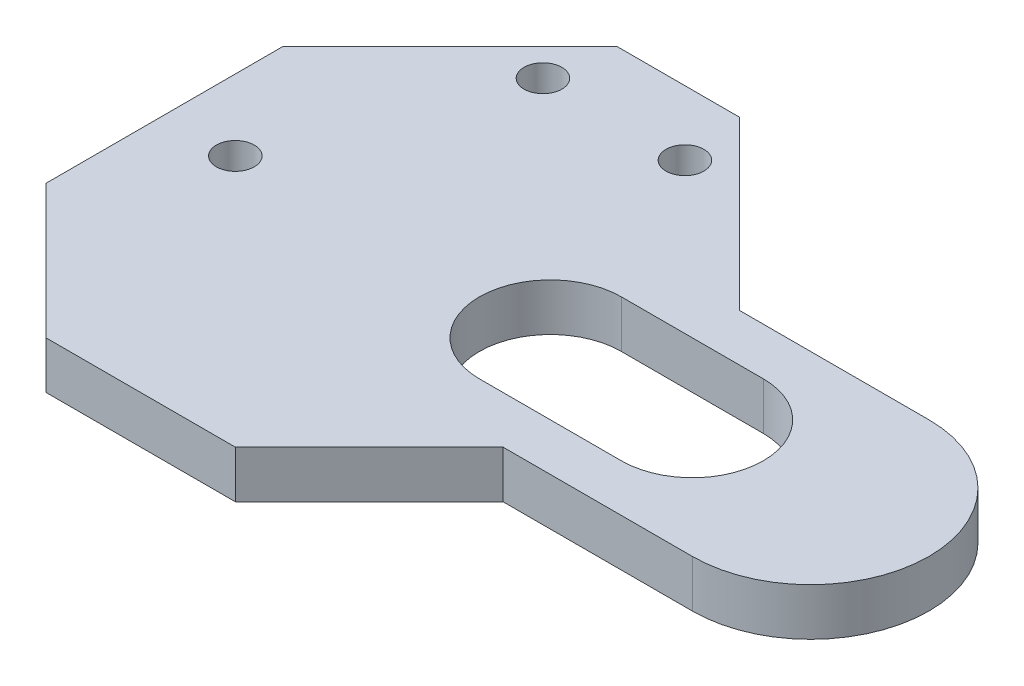
ISO-10303-21;
HEADER;
FILE_DESCRIPTION(('STEP AP214'),'2;1');
FILE_NAME('part.step','',(''),(''),'','','');
FILE_SCHEMA(('AUTOMOTIVE_DESIGN { 1 0 10303 214 1 1 1 1 }'));
ENDSEC;
DATA;
#1=APPLICATION_CONTEXT('core data for automotive mechanical design processes');
#2=APPLICATION_PROTOCOL_DEFINITION('international standard','automotive_design',2000,#1);
#3=PRODUCT_CONTEXT('',#1,'mechanical');
#4=PRODUCT('Part','Part','',(#3));
#5=PRODUCT_RELATED_PRODUCT_CATEGORY('part','',(#4));
#6=PRODUCT_DEFINITION_FORMATION('','',#4);
#7=PRODUCT_DEFINITION_CONTEXT('part definition',#1,'design');
#8=PRODUCT_DEFINITION('design','',#6,#7);
#9=PRODUCT_DEFINITION_SHAPE('','',#8);
#10=(LENGTH_UNIT() NAMED_UNIT(*) SI_UNIT(.MILLI.,.METRE.));
#11=(NAMED_UNIT(*) PLANE_ANGLE_UNIT() SI_UNIT($,.RADIAN.));
#12=(NAMED_UNIT(*) SI_UNIT($,.STERADIAN.) SOLID_ANGLE_UNIT());
#13=UNCERTAINTY_MEASURE_WITH_UNIT(LENGTH_MEASURE(1.E-05),#10,'distance_accuracy_value','');
#14=(GEOMETRIC_REPRESENTATION_CONTEXT(3) GLOBAL_UNCERTAINTY_ASSIGNED_CONTEXT((#13)) GLOBAL_UNIT_ASSIGNED_CONTEXT((#10,
#11,#12)) REPRESENTATION_CONTEXT('',''));
#15=CARTESIAN_POINT('',(0.,0.,0.));
#16=DIRECTION('',(0.,0.,1.));
#17=DIRECTION('',(1.,0.,0.));
#18=AXIS2_PLACEMENT_3D('',#15,#16,#17);
#19=CARTESIAN_POINT('',(108.284271247462,10.,-53.2842712474617));
#20=DIRECTION('',(0.,-1.,0.));
#21=DIRECTION('',(0.,0.,-1.));
#22=AXIS2_PLACEMENT_3D('',#19,#20,#21);
#23=PLANE('',#22);
#24=CARTESIAN_POINT('',(-13.2842712474621,10.,-53.2842712474617));
#25=DIRECTION('',(0.,1.,0.));
#26=DIRECTION('',(0.,0.,1.));
#27=AXIS2_PLACEMENT_3D('',#24,#25,#26);
#28=CIRCLE('',#27,4.);
#29=CARTESIAN_POINT('',(-13.2842712474621,10.,-49.2842712474617));
#30=VERTEX_POINT('',#29);
#31=EDGE_CURVE('E169',#30,#30,#28,.T.);
#32=ORIENTED_EDGE('',*,*,#31,.F.);
#33=EDGE_LOOP('',(#32));
#34=FACE_BOUND('',#33,.T.);
#35=CARTESIAN_POINT('',(4.99999999999999,10.,-100.));
#36=DIRECTION('',(0.,1.,0.));
#37=DIRECTION('',(0.,0.,1.));
#38=AXIS2_PLACEMENT_3D('',#35,#36,#37);
#39=CIRCLE('',#38,4.);
#40=CARTESIAN_POINT('',(4.99999999999999,10.,-96.));
#41=VERTEX_POINT('',#40);
#42=EDGE_CURVE('E181',#41,#41,#39,.T.);
#43=ORIENTED_EDGE('',*,*,#42,.F.);
#44=EDGE_LOOP('',(#43));
#45=FACE_BOUND('',#44,.T.);
#46=DIRECTION('',(0.707106781186554,0.,0.707106781186541));
#47=VECTOR('',#46,1.);
#48=CARTESIAN_POINT('',(0.,10.,0.));
#49=LINE('',#48,#47);
#50=CARTESIAN_POINT('',(-28.2842712474622,10.,-28.2842712474617));
#51=VERTEX_POINT('',#50);
#52=CARTESIAN_POINT('',(0.,10.,0.));
#53=VERTEX_POINT('',#52);
#54=EDGE_CURVE('E187',#51,#53,#49,.T.);
#55=ORIENTED_EDGE('',*,*,#54,.T.);
#56=DIRECTION('',(1.,0.,0.));
#57=VECTOR('',#56,1.);
#58=CARTESIAN_POINT('',(0.,10.,0.));
#59=LINE('',#58,#57);
#60=CARTESIAN_POINT('',(40.,10.,0.));
#61=VERTEX_POINT('',#60);
#62=EDGE_CURVE('E190',#53,#61,#59,.T.);
#63=ORIENTED_EDGE('',*,*,#62,.T.);
#64=DIRECTION('',(0.707106781186552,0.,-0.707106781186544));
#65=VECTOR('',#64,1.);
#66=CARTESIAN_POINT('',(68.2842712474621,10.,-28.2842712474617));
#67=LINE('',#66,#65);
#68=CARTESIAN_POINT('',(68.2842712474621,10.,-28.2842712474617));
#69=VERTEX_POINT('',#68);
#70=EDGE_CURVE('E193',#61,#69,#67,.T.);
#71=ORIENTED_EDGE('',*,*,#70,.T.);
#72=DIRECTION('',(1.,0.,0.));
#73=VECTOR('',#72,1.);
#74=CARTESIAN_POINT('',(108.284271247462,10.,-28.2842712474617));
#75=LINE('',#74,#73);
#76=CARTESIAN_POINT('',(108.284271247462,10.,-28.2842712474617));
#77=VERTEX_POINT('',#76);
#78=EDGE_CURVE('E195',#69,#77,#75,.T.);
#79=ORIENTED_EDGE('',*,*,#78,.T.);
#80=CARTESIAN_POINT('',(108.284271247462,10.,-53.2842712474617));
#81=DIRECTION('',(0.,1.,0.));
#82=DIRECTION('',(0.,0.,-1.));
#83=AXIS2_PLACEMENT_3D('',#80,#81,#82);
#84=CIRCLE('',#83,25.);
#85=CARTESIAN_POINT('',(108.284271247462,10.,-78.2842712474617));
#86=VERTEX_POINT('',#85);
#87=EDGE_CURVE('E197',#77,#86,#84,.T.);
#88=ORIENTED_EDGE('',*,*,#87,.T.);
#89=DIRECTION('',(-1.,0.,0.));
#90=VECTOR('',#89,1.);
#91=CARTESIAN_POINT('',(68.2842712474621,10.,-78.2842712474617));
#92=LINE('',#91,#90);
#93=CARTESIAN_POINT('',(68.2842712474621,10.,-78.2842712474617));
#94=VERTEX_POINT('',#93);
#95=EDGE_CURVE('E199',#86,#94,#92,.T.);
#96=ORIENTED_EDGE('',*,*,#95,.T.);
#97=DIRECTION('',(-0.707106781186549,0.,-0.707106781186546));
#98=VECTOR('',#97,1.);
#99=CARTESIAN_POINT('',(32.9289321881346,10.,-113.639610306789));
#100=LINE('',#99,#98);
#101=CARTESIAN_POINT('',(32.9289321881346,10.,-113.639610306789));
#102=VERTEX_POINT('',#101);
#103=EDGE_CURVE('E201',#94,#102,#100,.T.);
#104=ORIENTED_EDGE('',*,*,#103,.T.);
#105=DIRECTION('',(-1.,0.,0.));
#106=VECTOR('',#105,1.);
#107=CARTESIAN_POINT('',(7.07106781186537,10.,-113.639610306789));
#108=LINE('',#107,#106);
#109=CARTESIAN_POINT('',(7.07106781186537,10.,-113.639610306789));
#110=VERTEX_POINT('',#109);
#111=EDGE_CURVE('E203',#102,#110,#108,.T.);
#112=ORIENTED_EDGE('',*,*,#111,.T.);
#113=DIRECTION('',(-0.707106781186549,0.,0.707106781186546));
#114=VECTOR('',#113,1.);
#115=CARTESIAN_POINT('',(-28.2842712474621,10.,-78.2842712474617));
#116=LINE('',#115,#114);
#117=CARTESIAN_POINT('',(-28.2842712474621,10.,-78.2842712474617));
#118=VERTEX_POINT('',#117);
#119=EDGE_CURVE('E205',#110,#118,#116,.T.);
#120=ORIENTED_EDGE('',*,*,#119,.T.);
#121=DIRECTION('',(0.,0.,1.));
#122=VECTOR('',#121,1.);
#123=CARTESIAN_POINT('',(-28.2842712474622,10.,-28.2842712474617));
#124=LINE('',#123,#122);
#125=EDGE_CURVE('E207',#118,#51,#124,.T.);
#126=ORIENTED_EDGE('',*,*,#125,.T.);
#127=EDGE_LOOP('',(#55,#63,#71,#79,#88,#96,#104,#112,#120,#126));
#128=FACE_BOUND('',#127,.T.);
#129=CARTESIAN_POINT('',(35.,10.,-100.));
#130=DIRECTION('',(0.,1.,0.));
#131=DIRECTION('',(0.,0.,1.));
#132=AXIS2_PLACEMENT_3D('',#129,#130,#131);
#133=CIRCLE('',#132,4.00000000000001);
#134=CARTESIAN_POINT('',(35.,10.,-96.));
#135=VERTEX_POINT('',#134);
#136=EDGE_CURVE('E175',#135,#135,#133,.T.);
#137=ORIENTED_EDGE('',*,*,#136,.F.);
#138=EDGE_LOOP('',(#137));
#139=FACE_BOUND('',#138,.T.);
#140=CARTESIAN_POINT('',(53.2842712474621,10.,-53.2842712474617));
#141=DIRECTION('',(0.,1.,0.));
#142=DIRECTION('',(0.,0.,1.));
#143=AXIS2_PLACEMENT_3D('',#140,#141,#142);
#144=CIRCLE('',#143,15.);
#145=CARTESIAN_POINT('',(53.2842712474621,10.,-68.2842712474618));
#146=VERTEX_POINT('',#145);
#147=CARTESIAN_POINT('',(53.2842712474621,10.,-38.2842712474617));
#148=VERTEX_POINT('',#147);
#149=EDGE_CURVE('E133',#146,#148,#144,.T.);
#150=ORIENTED_EDGE('',*,*,#149,.F.);
#151=DIRECTION('',(-1.,0.,0.));
#152=VECTOR('',#151,1.);
#153=CARTESIAN_POINT('',(53.2842712474621,10.,-68.2842712474618));
#154=LINE('',#153,#152);
#155=CARTESIAN_POINT('',(83.2842712474621,10.,-68.2842712474618));
#156=VERTEX_POINT('',#155);
#157=EDGE_CURVE('E155',#156,#146,#154,.T.);
#158=ORIENTED_EDGE('',*,*,#157,.F.);
#159=CARTESIAN_POINT('',(83.2842712474621,10.,-53.2842712474617));
#160=DIRECTION('',(0.,1.,0.));
#161=DIRECTION('',(0.,0.,1.));
#162=AXIS2_PLACEMENT_3D('',#159,#160,#161);
#163=CIRCLE('',#162,15.);
#164=CARTESIAN_POINT('',(83.2842712474621,10.,-38.2842712474617));
#165=VERTEX_POINT('',#164);
#166=EDGE_CURVE('E153',#165,#156,#163,.T.);
#167=ORIENTED_EDGE('',*,*,#166,.F.);
#168=DIRECTION('',(1.,0.,0.));
#169=VECTOR('',#168,1.);
#170=CARTESIAN_POINT('',(53.2842712474621,10.,-38.2842712474617));
#171=LINE('',#170,#169);
#172=EDGE_CURVE('E141',#148,#165,#171,.T.);
#173=ORIENTED_EDGE('',*,*,#172,.F.);
#174=EDGE_LOOP('',(#150,#158,#167,#173));
#175=FACE_BOUND('',#174,.T.);
#176=ADVANCED_FACE('F32',(#34,#45,#128,#139,#175),#23,.F.);
#177=CARTESIAN_POINT('',(108.284271247462,0.,-53.2842712474617));
#178=DIRECTION('',(0.,-1.,0.));
#179=DIRECTION('',(0.,0.,-1.));
#180=AXIS2_PLACEMENT_3D('',#177,#178,#179);
#181=PLANE('',#180);
#182=CARTESIAN_POINT('',(-13.2842712474621,0.,-53.2842712474617));
#183=DIRECTION('',(0.,1.,0.));
#184=DIRECTION('',(0.,0.,1.));
#185=AXIS2_PLACEMENT_3D('',#182,#183,#184);
#186=CIRCLE('',#185,4.);
#187=CARTESIAN_POINT('',(-13.2842712474621,0.,-49.2842712474617));
#188=VERTEX_POINT('',#187);
#189=EDGE_CURVE('E149',#188,#188,#186,.T.);
#190=ORIENTED_EDGE('',*,*,#189,.T.);
#191=EDGE_LOOP('',(#190));
#192=FACE_BOUND('',#191,.T.);
#193=CARTESIAN_POINT('',(4.99999999999999,0.,-100.));
#194=DIRECTION('',(0.,1.,0.));
#195=DIRECTION('',(0.,0.,1.));
#196=AXIS2_PLACEMENT_3D('',#193,#194,#195);
#197=CIRCLE('',#196,4.);
#198=CARTESIAN_POINT('',(4.99999999999999,0.,-96.));
#199=VERTEX_POINT('',#198);
#200=EDGE_CURVE('E178',#199,#199,#197,.T.);
#201=ORIENTED_EDGE('',*,*,#200,.T.);
#202=EDGE_LOOP('',(#201));
#203=FACE_BOUND('',#202,.T.);
#204=DIRECTION('',(0.707106781186554,0.,0.707106781186541));
#205=VECTOR('',#204,1.);
#206=CARTESIAN_POINT('',(0.,0.,0.));
#207=LINE('',#206,#205);
#208=CARTESIAN_POINT('',(-28.2842712474622,0.,-28.2842712474617));
#209=VERTEX_POINT('',#208);
#210=CARTESIAN_POINT('',(0.,0.,0.));
#211=VERTEX_POINT('',#210);
#212=EDGE_CURVE('E184',#209,#211,#207,.T.);
#213=ORIENTED_EDGE('',*,*,#212,.F.);
#214=DIRECTION('',(0.,0.,1.));
#215=VECTOR('',#214,1.);
#216=CARTESIAN_POINT('',(-28.2842712474622,0.,-28.2842712474617));
#217=LINE('',#216,#215);
#218=CARTESIAN_POINT('',(-28.2842712474621,0.,-78.2842712474617));
#219=VERTEX_POINT('',#218);
#220=EDGE_CURVE('E191',#219,#209,#217,.T.);
#221=ORIENTED_EDGE('',*,*,#220,.F.);
#222=DIRECTION('',(-0.707106781186549,0.,0.707106781186546));
#223=VECTOR('',#222,1.);
#224=CARTESIAN_POINT('',(-28.2842712474621,0.,-78.2842712474617));
#225=LINE('',#224,#223);
#226=CARTESIAN_POINT('',(7.07106781186537,0.,-113.639610306789));
#227=VERTEX_POINT('',#226);
#228=EDGE_CURVE('E226',#227,#219,#225,.T.);
#229=ORIENTED_EDGE('',*,*,#228,.F.);
#230=DIRECTION('',(-1.,0.,0.));
#231=VECTOR('',#230,1.);
#232=CARTESIAN_POINT('',(7.07106781186537,0.,-113.639610306789));
#233=LINE('',#232,#231);
#234=CARTESIAN_POINT('',(32.9289321881346,0.,-113.639610306789));
#235=VERTEX_POINT('',#234);
#236=EDGE_CURVE('E224',#235,#227,#233,.T.);
#237=ORIENTED_EDGE('',*,*,#236,.F.);
#238=DIRECTION('',(-0.707106781186549,0.,-0.707106781186546));
#239=VECTOR('',#238,1.);
#240=CARTESIAN_POINT('',(32.9289321881346,0.,-113.639610306789));
#241=LINE('',#240,#239);
#242=CARTESIAN_POINT('',(68.2842712474621,0.,-78.2842712474617));
#243=VERTEX_POINT('',#242);
#244=EDGE_CURVE('E222',#243,#235,#241,.T.);
#245=ORIENTED_EDGE('',*,*,#244,.F.);
#246=DIRECTION('',(-1.,0.,0.));
#247=VECTOR('',#246,1.);
#248=CARTESIAN_POINT('',(68.2842712474621,0.,-78.2842712474617));
#249=LINE('',#248,#247);
#250=CARTESIAN_POINT('',(108.284271247462,0.,-78.2842712474617));
#251=VERTEX_POINT('',#250);
#252=EDGE_CURVE('E220',#251,#243,#249,.T.);
#253=ORIENTED_EDGE('',*,*,#252,.F.);
#254=CARTESIAN_POINT('',(108.284271247462,0.,-53.2842712474617));
#255=DIRECTION('',(0.,1.,0.));
#256=DIRECTION('',(0.,0.,-1.));
#257=AXIS2_PLACEMENT_3D('',#254,#255,#256);
#258=CIRCLE('',#257,25.);
#259=CARTESIAN_POINT('',(108.284271247462,0.,-28.2842712474617));
#260=VERTEX_POINT('',#259);
#261=EDGE_CURVE('E218',#260,#251,#258,.T.);
#262=ORIENTED_EDGE('',*,*,#261,.F.);
#263=DIRECTION('',(1.,0.,0.));
#264=VECTOR('',#263,1.);
#265=CARTESIAN_POINT('',(108.284271247462,0.,-28.2842712474617));
#266=LINE('',#265,#264);
#267=CARTESIAN_POINT('',(68.2842712474621,0.,-28.2842712474617));
#268=VERTEX_POINT('',#267);
#269=EDGE_CURVE('E216',#268,#260,#266,.T.);
#270=ORIENTED_EDGE('',*,*,#269,.F.);
#271=DIRECTION('',(0.707106781186552,0.,-0.707106781186544));
#272=VECTOR('',#271,1.);
#273=CARTESIAN_POINT('',(68.2842712474621,0.,-28.2842712474617));
#274=LINE('',#273,#272);
#275=CARTESIAN_POINT('',(40.,0.,0.));
#276=VERTEX_POINT('',#275);
#277=EDGE_CURVE('E214',#276,#268,#274,.T.);
#278=ORIENTED_EDGE('',*,*,#277,.F.);
#279=DIRECTION('',(1.,0.,0.));
#280=VECTOR('',#279,1.);
#281=CARTESIAN_POINT('',(0.,0.,0.));
#282=LINE('',#281,#280);
#283=EDGE_CURVE('E212',#211,#276,#282,.T.);
#284=ORIENTED_EDGE('',*,*,#283,.F.);
#285=EDGE_LOOP('',(#213,#221,#229,#237,#245,#253,#262,#270,#278,#284));
#286=FACE_BOUND('',#285,.T.);
#287=CARTESIAN_POINT('',(35.,0.,-100.));
#288=DIRECTION('',(0.,1.,0.));
#289=DIRECTION('',(0.,0.,1.));
#290=AXIS2_PLACEMENT_3D('',#287,#288,#289);
#291=CIRCLE('',#290,4.00000000000001);
#292=CARTESIAN_POINT('',(35.,0.,-96.));
#293=VERTEX_POINT('',#292);
#294=EDGE_CURVE('E172',#293,#293,#291,.T.);
#295=ORIENTED_EDGE('',*,*,#294,.T.);
#296=EDGE_LOOP('',(#295));
#297=FACE_BOUND('',#296,.T.);
#298=DIRECTION('',(-1.,0.,0.));
#299=VECTOR('',#298,1.);
#300=CARTESIAN_POINT('',(53.2842712474621,0.,-68.2842712474618));
#301=LINE('',#300,#299);
#302=CARTESIAN_POINT('',(83.2842712474621,0.,-68.2842712474618));
#303=VERTEX_POINT('',#302);
#304=CARTESIAN_POINT('',(53.2842712474621,0.,-68.2842712474618));
#305=VERTEX_POINT('',#304);
#306=EDGE_CURVE('E142',#303,#305,#301,.T.);
#307=ORIENTED_EDGE('',*,*,#306,.T.);
#308=CARTESIAN_POINT('',(53.2842712474621,0.,-53.2842712474617));
#309=DIRECTION('',(0.,1.,0.));
#310=DIRECTION('',(0.,0.,1.));
#311=AXIS2_PLACEMENT_3D('',#308,#309,#310);
#312=CIRCLE('',#311,15.);
#313=CARTESIAN_POINT('',(53.2842712474621,0.,-38.2842712474617));
#314=VERTEX_POINT('',#313);
#315=EDGE_CURVE('E55',#305,#314,#312,.T.);
#316=ORIENTED_EDGE('',*,*,#315,.T.);
#317=DIRECTION('',(1.,0.,0.));
#318=VECTOR('',#317,1.);
#319=CARTESIAN_POINT('',(53.2842712474621,0.,-38.2842712474617));
#320=LINE('',#319,#318);
#321=CARTESIAN_POINT('',(83.2842712474621,0.,-38.2842712474617));
#322=VERTEX_POINT('',#321);
#323=EDGE_CURVE('E148',#314,#322,#320,.T.);
#324=ORIENTED_EDGE('',*,*,#323,.T.);
#325=CARTESIAN_POINT('',(83.2842712474621,0.,-53.2842712474617));
#326=DIRECTION('',(0.,1.,0.));
#327=DIRECTION('',(0.,0.,1.));
#328=AXIS2_PLACEMENT_3D('',#325,#326,#327);
#329=CIRCLE('',#328,15.);
#330=EDGE_CURVE('E161',#322,#303,#329,.T.);
#331=ORIENTED_EDGE('',*,*,#330,.T.);
#332=EDGE_LOOP('',(#307,#316,#324,#331));
#333=FACE_BOUND('',#332,.T.);
#334=ADVANCED_FACE('F262',(#192,#203,#286,#297,#333),#181,.T.);
#335=CARTESIAN_POINT('',(0.,10.,0.));
#336=DIRECTION('',(0.707106781186541,0.,-0.707106781186554));
#337=DIRECTION('',(-0.707106781186554,0.,-0.707106781186541));
#338=AXIS2_PLACEMENT_3D('',#335,#336,#337);
#339=PLANE('',#338);
#340=ORIENTED_EDGE('',*,*,#212,.T.);
#341=DIRECTION('',(0.,-1.,0.));
#342=VECTOR('',#341,1.);
#343=CARTESIAN_POINT('',(0.,10.,0.));
#344=LINE('',#343,#342);
#345=EDGE_CURVE('E11',#53,#211,#344,.T.);
#346=ORIENTED_EDGE('',*,*,#345,.F.);
#347=ORIENTED_EDGE('',*,*,#54,.F.);
#348=DIRECTION('',(0.,-1.,0.));
#349=VECTOR('',#348,1.);
#350=CARTESIAN_POINT('',(-28.2842712474622,10.,-28.2842712474617));
#351=LINE('',#350,#349);
#352=EDGE_CURVE('E209',#51,#209,#351,.T.);
#353=ORIENTED_EDGE('',*,*,#352,.T.);
#354=EDGE_LOOP('',(#340,#346,#347,#353));
#355=FACE_BOUND('',#354,.T.);
#356=ADVANCED_FACE('F34',(#355),#339,.F.);
#357=CARTESIAN_POINT('',(0.,10.,0.));
#358=DIRECTION('',(0.,0.,-1.));
#359=DIRECTION('',(-1.,0.,0.));
#360=AXIS2_PLACEMENT_3D('',#357,#358,#359);
#361=PLANE('',#360);
#362=ORIENTED_EDGE('',*,*,#283,.T.);
#363=DIRECTION('',(0.,-1.,0.));
#364=VECTOR('',#363,1.);
#365=CARTESIAN_POINT('',(40.,10.,0.));
#366=LINE('',#365,#364);
#367=EDGE_CURVE('E40',#61,#276,#366,.T.);
#368=ORIENTED_EDGE('',*,*,#367,.F.);
#369=ORIENTED_EDGE('',*,*,#62,.F.);
#370=ORIENTED_EDGE('',*,*,#345,.T.);
#371=EDGE_LOOP('',(#362,#368,#369,#370));
#372=FACE_BOUND('',#371,.T.);
#373=ADVANCED_FACE('F280',(#372),#361,.F.);
#374=CARTESIAN_POINT('',(68.2842712474621,10.,-28.2842712474617));
#375=DIRECTION('',(-0.707106781186544,0.,-0.707106781186552));
#376=DIRECTION('',(-0.707106781186552,0.,0.707106781186544));
#377=AXIS2_PLACEMENT_3D('',#374,#375,#376);
#378=PLANE('',#377);
#379=ORIENTED_EDGE('',*,*,#277,.T.);
#380=DIRECTION('',(0.,-1.,0.));
#381=VECTOR('',#380,1.);
#382=CARTESIAN_POINT('',(68.2842712474621,10.,-28.2842712474617));
#383=LINE('',#382,#381);
#384=EDGE_CURVE('E249',#69,#268,#383,.T.);
#385=ORIENTED_EDGE('',*,*,#384,.F.);
#386=ORIENTED_EDGE('',*,*,#70,.F.);
#387=ORIENTED_EDGE('',*,*,#367,.T.);
#388=EDGE_LOOP('',(#379,#385,#386,#387));
#389=FACE_BOUND('',#388,.T.);
#390=ADVANCED_FACE('F256',(#389),#378,.F.);
#391=CARTESIAN_POINT('',(108.284271247462,10.,-28.2842712474617));
#392=DIRECTION('',(0.,0.,-1.));
#393=DIRECTION('',(-1.,0.,0.));
#394=AXIS2_PLACEMENT_3D('',#391,#392,#393);
#395=PLANE('',#394);
#396=ORIENTED_EDGE('',*,*,#269,.T.);
#397=DIRECTION('',(0.,-1.,0.));
#398=VECTOR('',#397,1.);
#399=CARTESIAN_POINT('',(108.284271247462,10.,-28.2842712474617));
#400=LINE('',#399,#398);
#401=EDGE_CURVE('E246',#77,#260,#400,.T.);
#402=ORIENTED_EDGE('',*,*,#401,.F.);
#403=ORIENTED_EDGE('',*,*,#78,.F.);
#404=ORIENTED_EDGE('',*,*,#384,.T.);
#405=EDGE_LOOP('',(#396,#402,#403,#404));
#406=FACE_BOUND('',#405,.T.);
#407=ADVANCED_FACE('F268',(#406),#395,.F.);
#408=CARTESIAN_POINT('',(108.284271247462,10.,-53.2842712474617));
#409=DIRECTION('',(0.,-1.,0.));
#410=DIRECTION('',(0.,0.,-1.));
#411=AXIS2_PLACEMENT_3D('',#408,#409,#410);
#412=CYLINDRICAL_SURFACE('',#411,25.);
#413=ORIENTED_EDGE('',*,*,#261,.T.);
#414=DIRECTION('',(0.,-1.,0.));
#415=VECTOR('',#414,1.);
#416=CARTESIAN_POINT('',(108.284271247462,10.,-78.2842712474617));
#417=LINE('',#416,#415);
#418=EDGE_CURVE('E243',#86,#251,#417,.T.);
#419=ORIENTED_EDGE('',*,*,#418,.F.);
#420=ORIENTED_EDGE('',*,*,#87,.F.);
#421=ORIENTED_EDGE('',*,*,#401,.T.);
#422=EDGE_LOOP('',(#413,#419,#420,#421));
#423=FACE_BOUND('',#422,.T.);
#424=ADVANCED_FACE('F272',(#423),#412,.T.);
#425=CARTESIAN_POINT('',(68.2842712474621,10.,-78.2842712474617));
#426=DIRECTION('',(0.,0.,1.));
#427=DIRECTION('',(1.,0.,0.));
#428=AXIS2_PLACEMENT_3D('',#425,#426,#427);
#429=PLANE('',#428);
#430=ORIENTED_EDGE('',*,*,#252,.T.);
#431=DIRECTION('',(0.,-1.,0.));
#432=VECTOR('',#431,1.);
#433=CARTESIAN_POINT('',(68.2842712474621,10.,-78.2842712474617));
#434=LINE('',#433,#432);
#435=EDGE_CURVE('E240',#94,#243,#434,.T.);
#436=ORIENTED_EDGE('',*,*,#435,.F.);
#437=ORIENTED_EDGE('',*,*,#95,.F.);
#438=ORIENTED_EDGE('',*,*,#418,.T.);
#439=EDGE_LOOP('',(#430,#436,#437,#438));
#440=FACE_BOUND('',#439,.T.);
#441=ADVANCED_FACE('F303',(#440),#429,.F.);
#442=CARTESIAN_POINT('',(32.9289321881346,10.,-113.639610306789));
#443=DIRECTION('',(-0.707106781186546,0.,0.707106781186549));
#444=DIRECTION('',(0.707106781186549,0.,0.707106781186546));
#445=AXIS2_PLACEMENT_3D('',#442,#443,#444);
#446=PLANE('',#445);
#447=ORIENTED_EDGE('',*,*,#244,.T.);
#448=DIRECTION('',(0.,-1.,0.));
#449=VECTOR('',#448,1.);
#450=CARTESIAN_POINT('',(32.9289321881346,10.,-113.639610306789));
#451=LINE('',#450,#449);
#452=EDGE_CURVE('E237',#102,#235,#451,.T.);
#453=ORIENTED_EDGE('',*,*,#452,.F.);
#454=ORIENTED_EDGE('',*,*,#103,.F.);
#455=ORIENTED_EDGE('',*,*,#435,.T.);
#456=EDGE_LOOP('',(#447,#453,#454,#455));
#457=FACE_BOUND('',#456,.T.);
#458=ADVANCED_FACE('F300',(#457),#446,.F.);
#459=CARTESIAN_POINT('',(7.07106781186537,10.,-113.639610306789));
#460=DIRECTION('',(0.,0.,1.));
#461=DIRECTION('',(1.,0.,0.));
#462=AXIS2_PLACEMENT_3D('',#459,#460,#461);
#463=PLANE('',#462);
#464=ORIENTED_EDGE('',*,*,#236,.T.);
#465=DIRECTION('',(0.,-1.,0.));
#466=VECTOR('',#465,1.);
#467=CARTESIAN_POINT('',(7.07106781186537,10.,-113.639610306789));
#468=LINE('',#467,#466);
#469=EDGE_CURVE('E234',#110,#227,#468,.T.);
#470=ORIENTED_EDGE('',*,*,#469,.F.);
#471=ORIENTED_EDGE('',*,*,#111,.F.);
#472=ORIENTED_EDGE('',*,*,#452,.T.);
#473=EDGE_LOOP('',(#464,#470,#471,#472));
#474=FACE_BOUND('',#473,.T.);
#475=ADVANCED_FACE('F296',(#474),#463,.F.);
#476=CARTESIAN_POINT('',(-28.2842712474621,10.,-78.2842712474617));
#477=DIRECTION('',(0.707106781186546,0.,0.707106781186549));
#478=DIRECTION('',(0.707106781186549,0.,-0.707106781186546));
#479=AXIS2_PLACEMENT_3D('',#476,#477,#478);
#480=PLANE('',#479);
#481=ORIENTED_EDGE('',*,*,#228,.T.);
#482=DIRECTION('',(0.,-1.,0.));
#483=VECTOR('',#482,1.);
#484=CARTESIAN_POINT('',(-28.2842712474621,10.,-78.2842712474617));
#485=LINE('',#484,#483);
#486=EDGE_CURVE('E231',#118,#219,#485,.T.);
#487=ORIENTED_EDGE('',*,*,#486,.F.);
#488=ORIENTED_EDGE('',*,*,#119,.F.);
#489=ORIENTED_EDGE('',*,*,#469,.T.);
#490=EDGE_LOOP('',(#481,#487,#488,#489));
#491=FACE_BOUND('',#490,.T.);
#492=ADVANCED_FACE('F292',(#491),#480,.F.);
#493=CARTESIAN_POINT('',(-28.2842712474622,10.,-28.2842712474617));
#494=DIRECTION('',(1.,0.,0.));
#495=DIRECTION('',(0.,0.,-1.));
#496=AXIS2_PLACEMENT_3D('',#493,#494,#495);
#497=PLANE('',#496);
#498=ORIENTED_EDGE('',*,*,#220,.T.);
#499=ORIENTED_EDGE('',*,*,#352,.F.);
#500=ORIENTED_EDGE('',*,*,#125,.F.);
#501=ORIENTED_EDGE('',*,*,#486,.T.);
#502=EDGE_LOOP('',(#498,#499,#500,#501));
#503=FACE_BOUND('',#502,.T.);
#504=ADVANCED_FACE('F287',(#503),#497,.F.);
#505=CARTESIAN_POINT('',(4.99999999999999,10.,-100.));
#506=DIRECTION('',(0.,-1.,0.));
#507=DIRECTION('',(0.,0.,-1.));
#508=AXIS2_PLACEMENT_3D('',#505,#506,#507);
#509=CYLINDRICAL_SURFACE('',#508,4.);
#510=ORIENTED_EDGE('',*,*,#42,.T.);
#511=EDGE_LOOP('',(#510));
#512=FACE_BOUND('',#511,.T.);
#513=ORIENTED_EDGE('',*,*,#200,.F.);
#514=EDGE_LOOP('',(#513));
#515=FACE_BOUND('',#514,.T.);
#516=ADVANCED_FACE('F323',(#512,#515),#509,.F.);
#517=CARTESIAN_POINT('',(35.,10.,-100.));
#518=DIRECTION('',(0.,-1.,0.));
#519=DIRECTION('',(0.,0.,-1.));
#520=AXIS2_PLACEMENT_3D('',#517,#518,#519);
#521=CYLINDRICAL_SURFACE('',#520,4.00000000000001);
#522=ORIENTED_EDGE('',*,*,#136,.T.);
#523=EDGE_LOOP('',(#522));
#524=FACE_BOUND('',#523,.T.);
#525=ORIENTED_EDGE('',*,*,#294,.F.);
#526=EDGE_LOOP('',(#525));
#527=FACE_BOUND('',#526,.T.);
#528=ADVANCED_FACE('F349',(#524,#527),#521,.F.);
#529=CARTESIAN_POINT('',(-13.2842712474621,10.,-53.2842712474617));
#530=DIRECTION('',(0.,-1.,0.));
#531=DIRECTION('',(0.,0.,-1.));
#532=AXIS2_PLACEMENT_3D('',#529,#530,#531);
#533=CYLINDRICAL_SURFACE('',#532,4.);
#534=ORIENTED_EDGE('',*,*,#31,.T.);
#535=EDGE_LOOP('',(#534));
#536=FACE_BOUND('',#535,.T.);
#537=ORIENTED_EDGE('',*,*,#189,.F.);
#538=EDGE_LOOP('',(#537));
#539=FACE_BOUND('',#538,.T.);
#540=ADVANCED_FACE('F356',(#536,#539),#533,.F.);
#541=CARTESIAN_POINT('',(53.2842712474621,10.,-53.2842712474617));
#542=DIRECTION('',(0.,-1.,0.));
#543=DIRECTION('',(0.,0.,-1.));
#544=AXIS2_PLACEMENT_3D('',#541,#542,#543);
#545=CYLINDRICAL_SURFACE('',#544,15.);
#546=ORIENTED_EDGE('',*,*,#315,.F.);
#547=DIRECTION('',(0.,-1.,0.));
#548=VECTOR('',#547,1.);
#549=CARTESIAN_POINT('',(53.2842712474621,10.,-68.2842712474618));
#550=LINE('',#549,#548);
#551=EDGE_CURVE('E137',#146,#305,#550,.T.);
#552=ORIENTED_EDGE('',*,*,#551,.F.);
#553=ORIENTED_EDGE('',*,*,#149,.T.);
#554=DIRECTION('',(0.,-1.,0.));
#555=VECTOR('',#554,1.);
#556=CARTESIAN_POINT('',(53.2842712474621,10.,-38.2842712474617));
#557=LINE('',#556,#555);
#558=EDGE_CURVE('E136',#148,#314,#557,.T.);
#559=ORIENTED_EDGE('',*,*,#558,.T.);
#560=EDGE_LOOP('',(#546,#552,#553,#559));
#561=FACE_BOUND('',#560,.T.);
#562=ADVANCED_FACE('F135',(#561),#545,.F.);
#563=CARTESIAN_POINT('',(53.2842712474621,10.,-38.2842712474617));
#564=DIRECTION('',(0.,0.,-1.));
#565=DIRECTION('',(-1.,0.,0.));
#566=AXIS2_PLACEMENT_3D('',#563,#564,#565);
#567=PLANE('',#566);
#568=ORIENTED_EDGE('',*,*,#323,.F.);
#569=ORIENTED_EDGE('',*,*,#558,.F.);
#570=ORIENTED_EDGE('',*,*,#172,.T.);
#571=DIRECTION('',(0.,-1.,0.));
#572=VECTOR('',#571,1.);
#573=CARTESIAN_POINT('',(83.2842712474621,10.,-38.2842712474617));
#574=LINE('',#573,#572);
#575=EDGE_CURVE('E150',#165,#322,#574,.T.);
#576=ORIENTED_EDGE('',*,*,#575,.T.);
#577=EDGE_LOOP('',(#568,#569,#570,#576));
#578=FACE_BOUND('',#577,.T.);
#579=ADVANCED_FACE('F145',(#578),#567,.T.);
#580=CARTESIAN_POINT('',(83.2842712474621,10.,-53.2842712474617));
#581=DIRECTION('',(0.,-1.,0.));
#582=DIRECTION('',(0.,0.,-1.));
#583=AXIS2_PLACEMENT_3D('',#580,#581,#582);
#584=CYLINDRICAL_SURFACE('',#583,15.);
#585=ORIENTED_EDGE('',*,*,#330,.F.);
#586=ORIENTED_EDGE('',*,*,#575,.F.);
#587=ORIENTED_EDGE('',*,*,#166,.T.);
#588=DIRECTION('',(0.,-1.,0.));
#589=VECTOR('',#588,1.);
#590=CARTESIAN_POINT('',(83.2842712474621,10.,-68.2842712474618));
#591=LINE('',#590,#589);
#592=EDGE_CURVE('E47',#156,#303,#591,.T.);
#593=ORIENTED_EDGE('',*,*,#592,.T.);
#594=EDGE_LOOP('',(#585,#586,#587,#593));
#595=FACE_BOUND('',#594,.T.);
#596=ADVANCED_FACE('F376',(#595),#584,.F.);
#597=CARTESIAN_POINT('',(53.2842712474621,10.,-68.2842712474618));
#598=DIRECTION('',(0.,0.,1.));
#599=DIRECTION('',(1.,0.,0.));
#600=AXIS2_PLACEMENT_3D('',#597,#598,#599);
#601=PLANE('',#600);
#602=ORIENTED_EDGE('',*,*,#306,.F.);
#603=ORIENTED_EDGE('',*,*,#592,.F.);
#604=ORIENTED_EDGE('',*,*,#157,.T.);
#605=ORIENTED_EDGE('',*,*,#551,.T.);
#606=EDGE_LOOP('',(#602,#603,#604,#605));
#607=FACE_BOUND('',#606,.T.);
#608=ADVANCED_FACE('F383',(#607),#601,.T.);
#609=CLOSED_SHELL('',(#176,#334,#356,#373,#390,#407,#424,#441,#458,#475,#492,#504,#516,#528,
#540,#562,#579,#596,#608));
#610=MANIFOLD_SOLID_BREP('B2',#609);
#611=ADVANCED_BREP_SHAPE_REPRESENTATION('',(#18,#610),#14);
#612=SHAPE_DEFINITION_REPRESENTATION(#9,#611);
ENDSEC;
END-ISO-10303-21;
